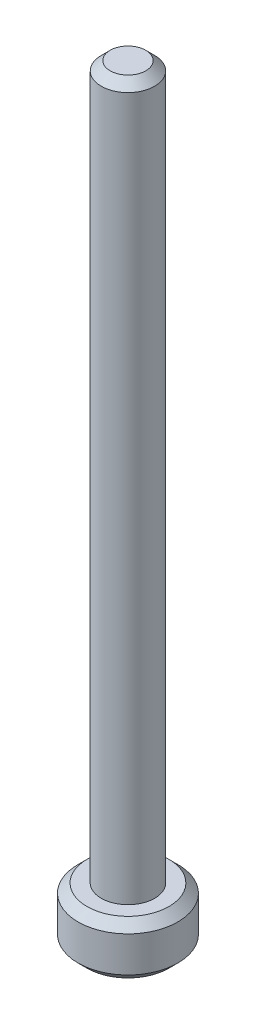
ISO-10303-21;
HEADER;
FILE_DESCRIPTION(('STEP AP214'),'2;1');
FILE_NAME('part.step','',(''),(''),'','','');
FILE_SCHEMA(('AUTOMOTIVE_DESIGN { 1 0 10303 214 1 1 1 1 }'));
ENDSEC;
DATA;
#1=APPLICATION_CONTEXT('core data for automotive mechanical design processes');
#2=APPLICATION_PROTOCOL_DEFINITION('international standard','automotive_design',2000,#1);
#3=PRODUCT_CONTEXT('',#1,'mechanical');
#4=PRODUCT('Part','Part','',(#3));
#5=PRODUCT_RELATED_PRODUCT_CATEGORY('part','',(#4));
#6=PRODUCT_DEFINITION_FORMATION('','',#4);
#7=PRODUCT_DEFINITION_CONTEXT('part definition',#1,'design');
#8=PRODUCT_DEFINITION('design','',#6,#7);
#9=PRODUCT_DEFINITION_SHAPE('','',#8);
#10=(LENGTH_UNIT() NAMED_UNIT(*) SI_UNIT(.MILLI.,.METRE.));
#11=(NAMED_UNIT(*) PLANE_ANGLE_UNIT() SI_UNIT($,.RADIAN.));
#12=(NAMED_UNIT(*) SI_UNIT($,.STERADIAN.) SOLID_ANGLE_UNIT());
#13=UNCERTAINTY_MEASURE_WITH_UNIT(LENGTH_MEASURE(1.E-05),#10,'distance_accuracy_value','');
#14=(GEOMETRIC_REPRESENTATION_CONTEXT(3) GLOBAL_UNCERTAINTY_ASSIGNED_CONTEXT((#13)) GLOBAL_UNIT_ASSIGNED_CONTEXT((#10,
#11,#12)) REPRESENTATION_CONTEXT('',''));
#15=CARTESIAN_POINT('',(0.,0.,0.));
#16=DIRECTION('',(0.,0.,1.));
#17=DIRECTION('',(1.,0.,0.));
#18=AXIS2_PLACEMENT_3D('',#15,#16,#17);
#19=CARTESIAN_POINT('',(0.,1.5,0.));
#20=DIRECTION('',(0.,-1.,0.));
#21=DIRECTION('',(0.,0.,-1.));
#22=AXIS2_PLACEMENT_3D('',#19,#20,#21);
#23=CYLINDRICAL_SURFACE('',#22,2.8);
#24=CARTESIAN_POINT('',(0.,1.,0.));
#25=DIRECTION('',(0.,1.,0.));
#26=DIRECTION('',(0.,0.,1.));
#27=AXIS2_PLACEMENT_3D('',#24,#25,#26);
#28=CIRCLE('',#27,2.8);
#29=CARTESIAN_POINT('',(0.,1.,2.8));
#30=VERTEX_POINT('',#29);
#31=EDGE_CURVE('E43',#30,#30,#28,.F.);
#32=ORIENTED_EDGE('',*,*,#31,.T.);
#33=EDGE_LOOP('',(#32));
#34=FACE_BOUND('',#33,.T.);
#35=CARTESIAN_POINT('',(0.,-0.999999999999992,0.));
#36=DIRECTION('',(0.,1.,0.));
#37=DIRECTION('',(0.,0.,1.));
#38=AXIS2_PLACEMENT_3D('',#35,#36,#37);
#39=CIRCLE('',#38,2.8);
#40=CARTESIAN_POINT('',(0.,-0.999999999999992,2.8));
#41=VERTEX_POINT('',#40);
#42=EDGE_CURVE('E47',#41,#41,#39,.T.);
#43=ORIENTED_EDGE('',*,*,#42,.T.);
#44=EDGE_LOOP('',(#43));
#45=FACE_BOUND('',#44,.T.);
#46=ADVANCED_FACE('F35',(#34,#45),#23,.T.);
#47=CARTESIAN_POINT('',(0.,1.5,0.));
#48=DIRECTION('',(0.,1.,0.));
#49=DIRECTION('',(0.,0.,1.));
#50=AXIS2_PLACEMENT_3D('',#47,#48,#49);
#51=PLANE('',#50);
#52=CARTESIAN_POINT('',(0.,1.5,0.));
#53=DIRECTION('',(0.,1.,0.));
#54=DIRECTION('',(0.,0.,1.));
#55=AXIS2_PLACEMENT_3D('',#52,#53,#54);
#56=CIRCLE('',#55,2.3);
#57=CARTESIAN_POINT('',(0.,1.5,2.3));
#58=VERTEX_POINT('',#57);
#59=EDGE_CURVE('E51',#58,#58,#56,.T.);
#60=ORIENTED_EDGE('',*,*,#59,.T.);
#61=EDGE_LOOP('',(#60));
#62=FACE_BOUND('',#61,.T.);
#63=CARTESIAN_POINT('',(0.,1.5,0.));
#64=DIRECTION('',(0.,1.,0.));
#65=DIRECTION('',(0.,0.,1.));
#66=AXIS2_PLACEMENT_3D('',#63,#64,#65);
#67=CIRCLE('',#66,1.5);
#68=CARTESIAN_POINT('',(0.,1.5,1.5));
#69=VERTEX_POINT('',#68);
#70=EDGE_CURVE('E62',#69,#69,#67,.T.);
#71=ORIENTED_EDGE('',*,*,#70,.F.);
#72=EDGE_LOOP('',(#71));
#73=FACE_BOUND('',#72,.T.);
#74=ADVANCED_FACE('F68',(#62,#73),#51,.T.);
#75=CARTESIAN_POINT('',(0.,-1.5,0.));
#76=DIRECTION('',(0.,1.,0.));
#77=DIRECTION('',(0.,0.,1.));
#78=AXIS2_PLACEMENT_3D('',#75,#76,#77);
#79=PLANE('',#78);
#80=CARTESIAN_POINT('',(0.,-1.5,0.));
#81=DIRECTION('',(0.,1.,0.));
#82=DIRECTION('',(0.,0.,1.));
#83=AXIS2_PLACEMENT_3D('',#80,#81,#82);
#84=CIRCLE('',#83,2.29999999999999);
#85=CARTESIAN_POINT('',(0.,-1.5,2.29999999999999));
#86=VERTEX_POINT('',#85);
#87=EDGE_CURVE('E10',#86,#86,#84,.F.);
#88=ORIENTED_EDGE('',*,*,#87,.T.);
#89=EDGE_LOOP('',(#88));
#90=FACE_BOUND('',#89,.T.);
#91=ADVANCED_FACE('F70',(#90),#79,.F.);
#92=CARTESIAN_POINT('',(0.,41.5,0.));
#93=DIRECTION('',(0.,-1.,0.));
#94=DIRECTION('',(0.,0.,-1.));
#95=AXIS2_PLACEMENT_3D('',#92,#93,#94);
#96=CYLINDRICAL_SURFACE('',#95,1.5);
#97=CARTESIAN_POINT('',(0.,41.,0.));
#98=DIRECTION('',(0.,1.,0.));
#99=DIRECTION('',(0.,0.,1.));
#100=AXIS2_PLACEMENT_3D('',#97,#98,#99);
#101=CIRCLE('',#100,1.5);
#102=CARTESIAN_POINT('',(0.,41.,1.5));
#103=VERTEX_POINT('',#102);
#104=EDGE_CURVE('E56',#103,#103,#101,.F.);
#105=ORIENTED_EDGE('',*,*,#104,.T.);
#106=EDGE_LOOP('',(#105));
#107=FACE_BOUND('',#106,.T.);
#108=ORIENTED_EDGE('',*,*,#70,.T.);
#109=EDGE_LOOP('',(#108));
#110=FACE_BOUND('',#109,.T.);
#111=ADVANCED_FACE('F66',(#107,#110),#96,.T.);
#112=CARTESIAN_POINT('',(0.,41.5,0.));
#113=DIRECTION('',(0.,1.,0.));
#114=DIRECTION('',(0.,0.,1.));
#115=AXIS2_PLACEMENT_3D('',#112,#113,#114);
#116=PLANE('',#115);
#117=CARTESIAN_POINT('',(0.,41.5,0.));
#118=DIRECTION('',(0.,1.,0.));
#119=DIRECTION('',(0.,0.,1.));
#120=AXIS2_PLACEMENT_3D('',#117,#118,#119);
#121=CIRCLE('',#120,1.00000000000001);
#122=CARTESIAN_POINT('',(0.,41.5,1.00000000000001));
#123=VERTEX_POINT('',#122);
#124=EDGE_CURVE('E59',#123,#123,#121,.T.);
#125=ORIENTED_EDGE('',*,*,#124,.T.);
#126=EDGE_LOOP('',(#125));
#127=FACE_BOUND('',#126,.T.);
#128=ADVANCED_FACE('F89',(#127),#116,.T.);
#129=CARTESIAN_POINT('',(0.,41.5,0.));
#130=DIRECTION('',(0.,-1.,0.));
#131=DIRECTION('',(0.,0.,-1.));
#132=AXIS2_PLACEMENT_3D('',#129,#130,#131);
#133=CONICAL_SURFACE('',#132,1.00000000000001,0.785398163397433);
#134=ORIENTED_EDGE('',*,*,#104,.F.);
#135=EDGE_LOOP('',(#134));
#136=FACE_BOUND('',#135,.T.);
#137=ORIENTED_EDGE('',*,*,#124,.F.);
#138=EDGE_LOOP('',(#137));
#139=FACE_BOUND('',#138,.T.);
#140=ADVANCED_FACE('F83',(#136,#139),#133,.T.);
#141=CARTESIAN_POINT('',(0.,1.5,0.));
#142=DIRECTION('',(0.,-1.,0.));
#143=DIRECTION('',(0.,0.,-1.));
#144=AXIS2_PLACEMENT_3D('',#141,#142,#143);
#145=CONICAL_SURFACE('',#144,2.3,0.785398163397446);
#146=ORIENTED_EDGE('',*,*,#31,.F.);
#147=EDGE_LOOP('',(#146));
#148=FACE_BOUND('',#147,.T.);
#149=ORIENTED_EDGE('',*,*,#59,.F.);
#150=EDGE_LOOP('',(#149));
#151=FACE_BOUND('',#150,.T.);
#152=ADVANCED_FACE('F88',(#148,#151),#145,.T.);
#153=CARTESIAN_POINT('',(0.,-0.999999999999992,0.));
#154=DIRECTION('',(0.,1.,0.));
#155=DIRECTION('',(0.,0.,1.));
#156=AXIS2_PLACEMENT_3D('',#153,#154,#155);
#157=CONICAL_SURFACE('',#156,2.8,0.785398163397451);
#158=ORIENTED_EDGE('',*,*,#87,.F.);
#159=EDGE_LOOP('',(#158));
#160=FACE_BOUND('',#159,.T.);
#161=ORIENTED_EDGE('',*,*,#42,.F.);
#162=EDGE_LOOP('',(#161));
#163=FACE_BOUND('',#162,.T.);
#164=ADVANCED_FACE('F38',(#160,#163),#157,.T.);
#165=CLOSED_SHELL('',(#46,#74,#91,#111,#128,#140,#152,#164));
#166=MANIFOLD_SOLID_BREP('B2',#165);
#167=ADVANCED_BREP_SHAPE_REPRESENTATION('',(#18,#166),#14);
#168=SHAPE_DEFINITION_REPRESENTATION(#9,#167);
ENDSEC;
END-ISO-10303-21;
